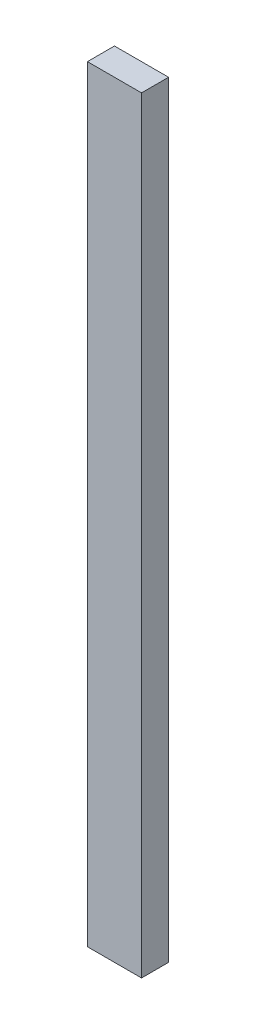
ISO-10303-21;
HEADER;
FILE_DESCRIPTION(('STEP AP214'),'2;1');
FILE_NAME('part.step','',(''),(''),'','','');
FILE_SCHEMA(('AUTOMOTIVE_DESIGN { 1 0 10303 214 1 1 1 1 }'));
ENDSEC;
DATA;
#1=APPLICATION_CONTEXT('core data for automotive mechanical design processes');
#2=APPLICATION_PROTOCOL_DEFINITION('international standard','automotive_design',2000,#1);
#3=PRODUCT_CONTEXT('',#1,'mechanical');
#4=PRODUCT('Part','Part','',(#3));
#5=PRODUCT_RELATED_PRODUCT_CATEGORY('part','',(#4));
#6=PRODUCT_DEFINITION_FORMATION('','',#4);
#7=PRODUCT_DEFINITION_CONTEXT('part definition',#1,'design');
#8=PRODUCT_DEFINITION('design','',#6,#7);
#9=PRODUCT_DEFINITION_SHAPE('','',#8);
#10=(LENGTH_UNIT() NAMED_UNIT(*) SI_UNIT(.MILLI.,.METRE.));
#11=(NAMED_UNIT(*) PLANE_ANGLE_UNIT() SI_UNIT($,.RADIAN.));
#12=(NAMED_UNIT(*) SI_UNIT($,.STERADIAN.) SOLID_ANGLE_UNIT());
#13=UNCERTAINTY_MEASURE_WITH_UNIT(LENGTH_MEASURE(1.E-05),#10,'distance_accuracy_value','');
#14=(GEOMETRIC_REPRESENTATION_CONTEXT(3) GLOBAL_UNCERTAINTY_ASSIGNED_CONTEXT((#13)) GLOBAL_UNIT_ASSIGNED_CONTEXT((#10,
#11,#12)) REPRESENTATION_CONTEXT('',''));
#15=CARTESIAN_POINT('',(0.,0.,0.));
#16=DIRECTION('',(0.,0.,1.));
#17=DIRECTION('',(1.,0.,0.));
#18=AXIS2_PLACEMENT_3D('',#15,#16,#17);
#19=CARTESIAN_POINT('',(0.,0.,-584.2));
#20=DIRECTION('',(0.,0.,1.));
#21=DIRECTION('',(1.,0.,0.));
#22=AXIS2_PLACEMENT_3D('',#19,#20,#21);
#23=PLANE('',#22);
#24=DIRECTION('',(1.,0.,0.));
#25=VECTOR('',#24,1.);
#26=CARTESIAN_POINT('',(-571.5,596.9,-584.2));
#27=LINE('',#26,#25);
#28=CARTESIAN_POINT('',(-609.6,596.9,-584.2));
#29=VERTEX_POINT('',#28);
#30=CARTESIAN_POINT('',(-571.5,596.9,-584.2));
#31=VERTEX_POINT('',#30);
#32=EDGE_CURVE('E67',#29,#31,#27,.T.);
#33=ORIENTED_EDGE('',*,*,#32,.F.);
#34=DIRECTION('',(0.,1.,0.));
#35=VECTOR('',#34,1.);
#36=CARTESIAN_POINT('',(-609.6,596.9,-584.2));
#37=LINE('',#36,#35);
#38=CARTESIAN_POINT('',(-609.6,57.15,-584.2));
#39=VERTEX_POINT('',#38);
#40=EDGE_CURVE('E19',#39,#29,#37,.T.);
#41=ORIENTED_EDGE('',*,*,#40,.F.);
#42=DIRECTION('',(1.,0.,0.));
#43=VECTOR('',#42,1.);
#44=CARTESIAN_POINT('',(-609.6,57.15,-584.2));
#45=LINE('',#44,#43);
#46=CARTESIAN_POINT('',(-571.5,57.15,-584.2));
#47=VERTEX_POINT('',#46);
#48=EDGE_CURVE('E57',#47,#39,#45,.F.);
#49=ORIENTED_EDGE('',*,*,#48,.F.);
#50=DIRECTION('',(0.,1.,0.));
#51=VECTOR('',#50,1.);
#52=CARTESIAN_POINT('',(-571.5,57.15,-584.2));
#53=LINE('',#52,#51);
#54=EDGE_CURVE('E52',#31,#47,#53,.F.);
#55=ORIENTED_EDGE('',*,*,#54,.F.);
#56=EDGE_LOOP('',(#33,#41,#49,#55));
#57=FACE_BOUND('',#56,.T.);
#58=ADVANCED_FACE('F16',(#57),#23,.T.);
#59=CARTESIAN_POINT('',(-609.6,596.9,-603.25));
#60=DIRECTION('',(-1.,0.,0.));
#61=DIRECTION('',(0.,0.,1.));
#62=AXIS2_PLACEMENT_3D('',#59,#60,#61);
#63=PLANE('',#62);
#64=DIRECTION('',(0.,0.,1.));
#65=VECTOR('',#64,1.);
#66=CARTESIAN_POINT('',(-609.6,596.9,-603.25));
#67=LINE('',#66,#65);
#68=CARTESIAN_POINT('',(-609.6,596.9,-603.25));
#69=VERTEX_POINT('',#68);
#70=EDGE_CURVE('E78',#69,#29,#67,.T.);
#71=ORIENTED_EDGE('',*,*,#70,.F.);
#72=DIRECTION('',(0.,1.,0.));
#73=VECTOR('',#72,1.);
#74=CARTESIAN_POINT('',(-609.6,0.,-603.25));
#75=LINE('',#74,#73);
#76=CARTESIAN_POINT('',(-609.6,57.15,-603.25));
#77=VERTEX_POINT('',#76);
#78=EDGE_CURVE('E73',#69,#77,#75,.F.);
#79=ORIENTED_EDGE('',*,*,#78,.T.);
#80=DIRECTION('',(0.,0.,-1.));
#81=VECTOR('',#80,1.);
#82=CARTESIAN_POINT('',(-609.6,57.15,-603.25));
#83=LINE('',#82,#81);
#84=EDGE_CURVE('E62',#39,#77,#83,.T.);
#85=ORIENTED_EDGE('',*,*,#84,.F.);
#86=ORIENTED_EDGE('',*,*,#40,.T.);
#87=EDGE_LOOP('',(#71,#79,#85,#86));
#88=FACE_BOUND('',#87,.T.);
#89=ADVANCED_FACE('F72',(#88),#63,.T.);
#90=CARTESIAN_POINT('',(-609.6,57.15,-603.25));
#91=DIRECTION('',(0.,-1.,0.));
#92=DIRECTION('',(0.,0.,-1.));
#93=AXIS2_PLACEMENT_3D('',#90,#91,#92);
#94=PLANE('',#93);
#95=ORIENTED_EDGE('',*,*,#84,.T.);
#96=DIRECTION('',(1.,0.,0.));
#97=VECTOR('',#96,1.);
#98=CARTESIAN_POINT('',(0.,57.15,-603.25));
#99=LINE('',#98,#97);
#100=CARTESIAN_POINT('',(-571.5,57.15,-603.25));
#101=VERTEX_POINT('',#100);
#102=EDGE_CURVE('E83',#77,#101,#99,.T.);
#103=ORIENTED_EDGE('',*,*,#102,.T.);
#104=DIRECTION('',(0.,0.,-1.));
#105=VECTOR('',#104,1.);
#106=CARTESIAN_POINT('',(-571.5,57.15,-603.25));
#107=LINE('',#106,#105);
#108=EDGE_CURVE('E64',#47,#101,#107,.T.);
#109=ORIENTED_EDGE('',*,*,#108,.F.);
#110=ORIENTED_EDGE('',*,*,#48,.T.);
#111=EDGE_LOOP('',(#95,#103,#109,#110));
#112=FACE_BOUND('',#111,.T.);
#113=ADVANCED_FACE('F59',(#112),#94,.T.);
#114=CARTESIAN_POINT('',(-571.5,57.15,-603.25));
#115=DIRECTION('',(1.,0.,0.));
#116=DIRECTION('',(0.,0.,-1.));
#117=AXIS2_PLACEMENT_3D('',#114,#115,#116);
#118=PLANE('',#117);
#119=ORIENTED_EDGE('',*,*,#108,.T.);
#120=DIRECTION('',(0.,1.,0.));
#121=VECTOR('',#120,1.);
#122=CARTESIAN_POINT('',(-571.5,0.,-603.25));
#123=LINE('',#122,#121);
#124=CARTESIAN_POINT('',(-571.5,596.9,-603.25));
#125=VERTEX_POINT('',#124);
#126=EDGE_CURVE('E25',#101,#125,#123,.T.);
#127=ORIENTED_EDGE('',*,*,#126,.T.);
#128=DIRECTION('',(0.,0.,1.));
#129=VECTOR('',#128,1.);
#130=CARTESIAN_POINT('',(-571.5,596.9,-603.25));
#131=LINE('',#130,#129);
#132=EDGE_CURVE('E33',#31,#125,#131,.F.);
#133=ORIENTED_EDGE('',*,*,#132,.F.);
#134=ORIENTED_EDGE('',*,*,#54,.T.);
#135=EDGE_LOOP('',(#119,#127,#133,#134));
#136=FACE_BOUND('',#135,.T.);
#137=ADVANCED_FACE('F87',(#136),#118,.T.);
#138=CARTESIAN_POINT('',(-571.5,596.9,-603.25));
#139=DIRECTION('',(0.,1.,0.));
#140=DIRECTION('',(0.,0.,1.));
#141=AXIS2_PLACEMENT_3D('',#138,#139,#140);
#142=PLANE('',#141);
#143=ORIENTED_EDGE('',*,*,#132,.T.);
#144=DIRECTION('',(1.,0.,0.));
#145=VECTOR('',#144,1.);
#146=CARTESIAN_POINT('',(0.,596.9,-603.25));
#147=LINE('',#146,#145);
#148=EDGE_CURVE('E11',#125,#69,#147,.F.);
#149=ORIENTED_EDGE('',*,*,#148,.T.);
#150=ORIENTED_EDGE('',*,*,#70,.T.);
#151=ORIENTED_EDGE('',*,*,#32,.T.);
#152=EDGE_LOOP('',(#143,#149,#150,#151));
#153=FACE_BOUND('',#152,.T.);
#154=ADVANCED_FACE('F90',(#153),#142,.T.);
#155=CARTESIAN_POINT('',(0.,0.,-603.25));
#156=DIRECTION('',(0.,0.,1.));
#157=DIRECTION('',(1.,0.,0.));
#158=AXIS2_PLACEMENT_3D('',#155,#156,#157);
#159=PLANE('',#158);
#160=ORIENTED_EDGE('',*,*,#126,.F.);
#161=ORIENTED_EDGE('',*,*,#102,.F.);
#162=ORIENTED_EDGE('',*,*,#78,.F.);
#163=ORIENTED_EDGE('',*,*,#148,.F.);
#164=EDGE_LOOP('',(#160,#161,#162,#163));
#165=FACE_BOUND('',#164,.T.);
#166=ADVANCED_FACE('F89',(#165),#159,.F.);
#167=CLOSED_SHELL('',(#58,#89,#113,#137,#154,#166));
#168=MANIFOLD_SOLID_BREP('B1',#167);
#169=ADVANCED_BREP_SHAPE_REPRESENTATION('',(#18,#168),#14);
#170=SHAPE_DEFINITION_REPRESENTATION(#9,#169);
ENDSEC;
END-ISO-10303-21;
